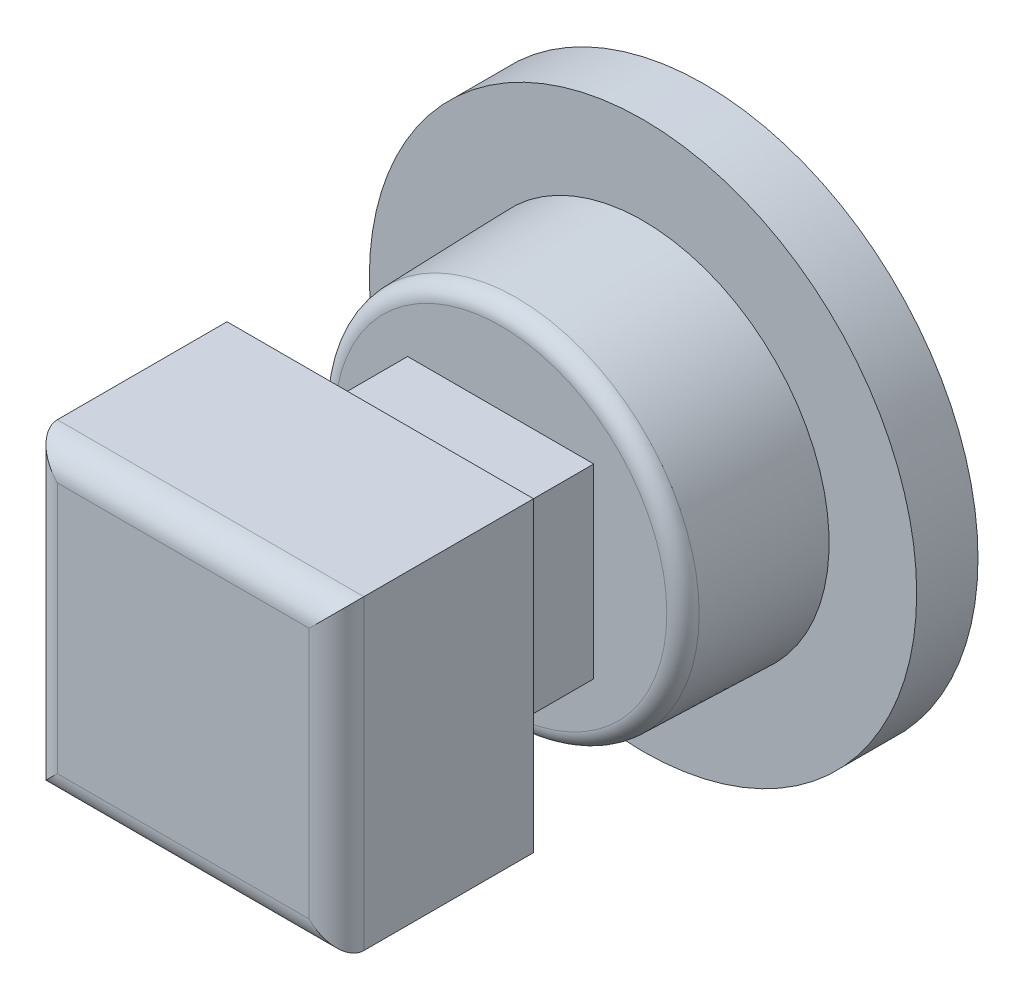
ISO-10303-21;
HEADER;
FILE_DESCRIPTION(('STEP AP214'),'2;1');
FILE_NAME('part.step','',(''),(''),'','','');
FILE_SCHEMA(('AUTOMOTIVE_DESIGN { 1 0 10303 214 1 1 1 1 }'));
ENDSEC;
DATA;
#1=APPLICATION_CONTEXT('core data for automotive mechanical design processes');
#2=APPLICATION_PROTOCOL_DEFINITION('international standard','automotive_design',2000,#1);
#3=PRODUCT_CONTEXT('',#1,'mechanical');
#4=PRODUCT('Part','Part','',(#3));
#5=PRODUCT_RELATED_PRODUCT_CATEGORY('part','',(#4));
#6=PRODUCT_DEFINITION_FORMATION('','',#4);
#7=PRODUCT_DEFINITION_CONTEXT('part definition',#1,'design');
#8=PRODUCT_DEFINITION('design','',#6,#7);
#9=PRODUCT_DEFINITION_SHAPE('','',#8);
#10=(LENGTH_UNIT() NAMED_UNIT(*) SI_UNIT(.MILLI.,.METRE.));
#11=(NAMED_UNIT(*) PLANE_ANGLE_UNIT() SI_UNIT($,.RADIAN.));
#12=(NAMED_UNIT(*) SI_UNIT($,.STERADIAN.) SOLID_ANGLE_UNIT());
#13=UNCERTAINTY_MEASURE_WITH_UNIT(LENGTH_MEASURE(1.E-05),#10,'distance_accuracy_value','');
#14=(GEOMETRIC_REPRESENTATION_CONTEXT(3) GLOBAL_UNCERTAINTY_ASSIGNED_CONTEXT((#13)) GLOBAL_UNIT_ASSIGNED_CONTEXT((#10,
#11,#12)) REPRESENTATION_CONTEXT('',''));
#15=CARTESIAN_POINT('',(0.,0.,0.));
#16=DIRECTION('',(0.,0.,1.));
#17=DIRECTION('',(1.,0.,0.));
#18=AXIS2_PLACEMENT_3D('',#15,#16,#17);
#19=CARTESIAN_POINT('',(0.,0.,4.76));
#20=DIRECTION('',(0.,0.,1.));
#21=DIRECTION('',(1.,0.,0.));
#22=AXIS2_PLACEMENT_3D('',#19,#20,#21);
#23=PLANE('',#22);
#24=DIRECTION('',(1.,0.,0.));
#25=VECTOR('',#24,1.);
#26=CARTESIAN_POINT('',(-0.7,1.15,4.76));
#27=LINE('',#26,#25);
#28=CARTESIAN_POINT('',(-1.15,1.15,4.76));
#29=VERTEX_POINT('',#28);
#30=CARTESIAN_POINT('',(1.15,1.15,4.76));
#31=VERTEX_POINT('',#30);
#32=EDGE_CURVE('E157',#29,#31,#27,.T.);
#33=ORIENTED_EDGE('',*,*,#32,.F.);
#34=DIRECTION('',(0.,1.,0.));
#35=VECTOR('',#34,1.);
#36=CARTESIAN_POINT('',(-1.15,-0.7,4.76));
#37=LINE('',#36,#35);
#38=CARTESIAN_POINT('',(-1.15,-1.15,4.76));
#39=VERTEX_POINT('',#38);
#40=EDGE_CURVE('E171',#39,#29,#37,.T.);
#41=ORIENTED_EDGE('',*,*,#40,.F.);
#42=DIRECTION('',(-1.,0.,0.));
#43=VECTOR('',#42,1.);
#44=CARTESIAN_POINT('',(0.700000000000001,-1.15,4.76));
#45=LINE('',#44,#43);
#46=CARTESIAN_POINT('',(1.15,-1.15,4.76));
#47=VERTEX_POINT('',#46);
#48=EDGE_CURVE('E160',#47,#39,#45,.T.);
#49=ORIENTED_EDGE('',*,*,#48,.F.);
#50=DIRECTION('',(0.,-1.,0.));
#51=VECTOR('',#50,1.);
#52=CARTESIAN_POINT('',(1.15,0.7,4.76));
#53=LINE('',#52,#51);
#54=EDGE_CURVE('E154',#31,#47,#53,.T.);
#55=ORIENTED_EDGE('',*,*,#54,.F.);
#56=EDGE_LOOP('',(#33,#41,#49,#55));
#57=FACE_BOUND('',#56,.T.);
#58=ADVANCED_FACE('F16',(#57),#23,.T.);
#59=CARTESIAN_POINT('',(1.15,0.7,4.51));
#60=DIRECTION('',(0.,-1.,0.));
#61=DIRECTION('',(0.,0.,-1.));
#62=AXIS2_PLACEMENT_3D('',#59,#60,#61);
#63=CYLINDRICAL_SURFACE('',#62,0.25);
#64=DIRECTION('',(0.,1.,0.));
#65=VECTOR('',#64,1.);
#66=CARTESIAN_POINT('',(1.4,1.4,4.51));
#67=LINE('',#66,#65);
#68=CARTESIAN_POINT('',(1.4,1.4,4.51));
#69=VERTEX_POINT('',#68);
#70=CARTESIAN_POINT('',(1.4,-1.4,4.51));
#71=VERTEX_POINT('',#70);
#72=EDGE_CURVE('E168',#69,#71,#67,.F.);
#73=ORIENTED_EDGE('',*,*,#72,.F.);
#74=CARTESIAN_POINT('',(1.15,1.15,4.51));
#75=DIRECTION('',(0.707106781186548,-0.707106781186547,0.));
#76=DIRECTION('',(0.707106781186547,0.707106781186547,0.));
#77=AXIS2_PLACEMENT_3D('',#74,#75,#76);
#78=ELLIPSE('',#77,0.353553390593274,0.25);
#79=EDGE_CURVE('E20',#31,#69,#78,.F.);
#80=ORIENTED_EDGE('',*,*,#79,.F.);
#81=ORIENTED_EDGE('',*,*,#54,.T.);
#82=CARTESIAN_POINT('',(1.15,-1.15,4.51));
#83=DIRECTION('',(-0.707106781186547,-0.707106781186547,0.));
#84=DIRECTION('',(-0.707106781186547,0.707106781186547,0.));
#85=AXIS2_PLACEMENT_3D('',#82,#83,#84);
#86=ELLIPSE('',#85,0.353553390593274,0.25);
#87=EDGE_CURVE('E267',#71,#47,#86,.T.);
#88=ORIENTED_EDGE('',*,*,#87,.F.);
#89=EDGE_LOOP('',(#73,#80,#81,#88));
#90=FACE_BOUND('',#89,.T.);
#91=ADVANCED_FACE('F166',(#90),#63,.T.);
#92=CARTESIAN_POINT('',(-0.7,1.15,4.51));
#93=DIRECTION('',(1.,0.,0.));
#94=DIRECTION('',(0.,1.,0.));
#95=AXIS2_PLACEMENT_3D('',#92,#93,#94);
#96=CYLINDRICAL_SURFACE('',#95,0.25);
#97=DIRECTION('',(1.,0.,0.));
#98=VECTOR('',#97,1.);
#99=CARTESIAN_POINT('',(-1.4,1.4,4.51));
#100=LINE('',#99,#98);
#101=CARTESIAN_POINT('',(-1.4,1.4,4.51));
#102=VERTEX_POINT('',#101);
#103=EDGE_CURVE('E179',#102,#69,#100,.T.);
#104=ORIENTED_EDGE('',*,*,#103,.F.);
#105=CARTESIAN_POINT('',(-1.15,1.15,4.51));
#106=DIRECTION('',(0.707106781186547,0.707106781186548,0.));
#107=DIRECTION('',(-0.707106781186548,0.707106781186547,0.));
#108=AXIS2_PLACEMENT_3D('',#105,#106,#107);
#109=ELLIPSE('',#108,0.353553390593274,0.25);
#110=EDGE_CURVE('E174',#29,#102,#109,.F.);
#111=ORIENTED_EDGE('',*,*,#110,.F.);
#112=ORIENTED_EDGE('',*,*,#32,.T.);
#113=ORIENTED_EDGE('',*,*,#79,.T.);
#114=EDGE_LOOP('',(#104,#111,#112,#113));
#115=FACE_BOUND('',#114,.T.);
#116=ADVANCED_FACE('F172',(#115),#96,.T.);
#117=CARTESIAN_POINT('',(-1.15,-0.7,4.51));
#118=DIRECTION('',(0.,1.,0.));
#119=DIRECTION('',(-1.,0.,0.));
#120=AXIS2_PLACEMENT_3D('',#117,#118,#119);
#121=CYLINDRICAL_SURFACE('',#120,0.25);
#122=DIRECTION('',(0.,1.,0.));
#123=VECTOR('',#122,1.);
#124=CARTESIAN_POINT('',(-1.4,-1.4,4.51));
#125=LINE('',#124,#123);
#126=CARTESIAN_POINT('',(-1.4,-1.4,4.51));
#127=VERTEX_POINT('',#126);
#128=EDGE_CURVE('E183',#127,#102,#125,.T.);
#129=ORIENTED_EDGE('',*,*,#128,.F.);
#130=CARTESIAN_POINT('',(-1.15,-1.15,4.51));
#131=DIRECTION('',(-0.707106781186548,0.707106781186547,0.));
#132=DIRECTION('',(-0.707106781186547,-0.707106781186548,0.));
#133=AXIS2_PLACEMENT_3D('',#130,#131,#132);
#134=ELLIPSE('',#133,0.353553390593274,0.25);
#135=EDGE_CURVE('E269',#39,#127,#134,.F.);
#136=ORIENTED_EDGE('',*,*,#135,.F.);
#137=ORIENTED_EDGE('',*,*,#40,.T.);
#138=ORIENTED_EDGE('',*,*,#110,.T.);
#139=EDGE_LOOP('',(#129,#136,#137,#138));
#140=FACE_BOUND('',#139,.T.);
#141=ADVANCED_FACE('F292',(#140),#121,.T.);
#142=CARTESIAN_POINT('',(0.700000000000001,-1.15,4.51));
#143=DIRECTION('',(-1.,0.,0.));
#144=DIRECTION('',(0.,0.,1.));
#145=AXIS2_PLACEMENT_3D('',#142,#143,#144);
#146=CYLINDRICAL_SURFACE('',#145,0.25);
#147=DIRECTION('',(1.,0.,0.));
#148=VECTOR('',#147,1.);
#149=CARTESIAN_POINT('',(1.4,-1.4,4.51));
#150=LINE('',#149,#148);
#151=EDGE_CURVE('E280',#71,#127,#150,.F.);
#152=ORIENTED_EDGE('',*,*,#151,.F.);
#153=ORIENTED_EDGE('',*,*,#87,.T.);
#154=ORIENTED_EDGE('',*,*,#48,.T.);
#155=ORIENTED_EDGE('',*,*,#135,.T.);
#156=EDGE_LOOP('',(#152,#153,#154,#155));
#157=FACE_BOUND('',#156,.T.);
#158=ADVANCED_FACE('F295',(#157),#146,.T.);
#159=CARTESIAN_POINT('',(1.4,1.4,2.96));
#160=DIRECTION('',(1.,0.,0.));
#161=DIRECTION('',(0.,0.,-1.));
#162=AXIS2_PLACEMENT_3D('',#159,#160,#161);
#163=PLANE('',#162);
#164=DIRECTION('',(0.,1.,0.));
#165=VECTOR('',#164,1.);
#166=CARTESIAN_POINT('',(1.4,0.,2.96));
#167=LINE('',#166,#165);
#168=CARTESIAN_POINT('',(1.4,-1.4,2.96));
#169=VERTEX_POINT('',#168);
#170=CARTESIAN_POINT('',(1.4,1.4,2.96));
#171=VERTEX_POINT('',#170);
#172=EDGE_CURVE('E310',#169,#171,#167,.T.);
#173=ORIENTED_EDGE('',*,*,#172,.T.);
#174=DIRECTION('',(0.,0.,1.));
#175=VECTOR('',#174,1.);
#176=CARTESIAN_POINT('',(1.4,1.4,2.96));
#177=LINE('',#176,#175);
#178=EDGE_CURVE('E181',#69,#171,#177,.F.);
#179=ORIENTED_EDGE('',*,*,#178,.F.);
#180=ORIENTED_EDGE('',*,*,#72,.T.);
#181=DIRECTION('',(0.,0.,-1.));
#182=VECTOR('',#181,1.);
#183=CARTESIAN_POINT('',(1.4,-1.4,2.96));
#184=LINE('',#183,#182);
#185=EDGE_CURVE('E302',#169,#71,#184,.F.);
#186=ORIENTED_EDGE('',*,*,#185,.F.);
#187=EDGE_LOOP('',(#173,#179,#180,#186));
#188=FACE_BOUND('',#187,.T.);
#189=ADVANCED_FACE('F301',(#188),#163,.T.);
#190=CARTESIAN_POINT('',(-1.4,1.4,2.96));
#191=DIRECTION('',(0.,1.,0.));
#192=DIRECTION('',(0.,0.,1.));
#193=AXIS2_PLACEMENT_3D('',#190,#191,#192);
#194=PLANE('',#193);
#195=DIRECTION('',(1.,0.,0.));
#196=VECTOR('',#195,1.);
#197=CARTESIAN_POINT('',(0.,1.4,2.96));
#198=LINE('',#197,#196);
#199=CARTESIAN_POINT('',(-1.4,1.4,2.96));
#200=VERTEX_POINT('',#199);
#201=EDGE_CURVE('E312',#171,#200,#198,.F.);
#202=ORIENTED_EDGE('',*,*,#201,.T.);
#203=DIRECTION('',(0.,0.,1.));
#204=VECTOR('',#203,1.);
#205=CARTESIAN_POINT('',(-1.4,1.4,2.96));
#206=LINE('',#205,#204);
#207=EDGE_CURVE('E278',#102,#200,#206,.F.);
#208=ORIENTED_EDGE('',*,*,#207,.F.);
#209=ORIENTED_EDGE('',*,*,#103,.T.);
#210=ORIENTED_EDGE('',*,*,#178,.T.);
#211=EDGE_LOOP('',(#202,#208,#209,#210));
#212=FACE_BOUND('',#211,.T.);
#213=ADVANCED_FACE('F441',(#212),#194,.T.);
#214=CARTESIAN_POINT('',(-1.4,-1.4,2.96));
#215=DIRECTION('',(-1.,0.,0.));
#216=DIRECTION('',(0.,0.,1.));
#217=AXIS2_PLACEMENT_3D('',#214,#215,#216);
#218=PLANE('',#217);
#219=DIRECTION('',(0.,1.,0.));
#220=VECTOR('',#219,1.);
#221=CARTESIAN_POINT('',(-1.4,0.,2.96));
#222=LINE('',#221,#220);
#223=CARTESIAN_POINT('',(-1.4,-1.4,2.96));
#224=VERTEX_POINT('',#223);
#225=EDGE_CURVE('E317',#200,#224,#222,.F.);
#226=ORIENTED_EDGE('',*,*,#225,.T.);
#227=DIRECTION('',(0.,0.,-1.));
#228=VECTOR('',#227,1.);
#229=CARTESIAN_POINT('',(-1.4,-1.4,2.96));
#230=LINE('',#229,#228);
#231=EDGE_CURVE('E287',#127,#224,#230,.T.);
#232=ORIENTED_EDGE('',*,*,#231,.F.);
#233=ORIENTED_EDGE('',*,*,#128,.T.);
#234=ORIENTED_EDGE('',*,*,#207,.T.);
#235=EDGE_LOOP('',(#226,#232,#233,#234));
#236=FACE_BOUND('',#235,.T.);
#237=ADVANCED_FACE('F290',(#236),#218,.T.);
#238=CARTESIAN_POINT('',(1.4,-1.4,2.96));
#239=DIRECTION('',(0.,-1.,0.));
#240=DIRECTION('',(0.,0.,-1.));
#241=AXIS2_PLACEMENT_3D('',#238,#239,#240);
#242=PLANE('',#241);
#243=DIRECTION('',(1.,0.,0.));
#244=VECTOR('',#243,1.);
#245=CARTESIAN_POINT('',(0.,-1.4,2.96));
#246=LINE('',#245,#244);
#247=EDGE_CURVE('E308',#224,#169,#246,.T.);
#248=ORIENTED_EDGE('',*,*,#247,.T.);
#249=ORIENTED_EDGE('',*,*,#185,.T.);
#250=ORIENTED_EDGE('',*,*,#151,.T.);
#251=ORIENTED_EDGE('',*,*,#231,.T.);
#252=EDGE_LOOP('',(#248,#249,#250,#251));
#253=FACE_BOUND('',#252,.T.);
#254=ADVANCED_FACE('F306',(#253),#242,.T.);
#255=CARTESIAN_POINT('',(0.,0.,2.96));
#256=DIRECTION('',(0.,0.,1.));
#257=DIRECTION('',(1.,0.,0.));
#258=AXIS2_PLACEMENT_3D('',#255,#256,#257);
#259=PLANE('',#258);
#260=DIRECTION('',(1.,0.,0.));
#261=VECTOR('',#260,1.);
#262=CARTESIAN_POINT('',(0.85,-0.85,2.96));
#263=LINE('',#262,#261);
#264=CARTESIAN_POINT('',(0.85,-0.85,2.96));
#265=VERTEX_POINT('',#264);
#266=CARTESIAN_POINT('',(-0.85,-0.85,2.96));
#267=VERTEX_POINT('',#266);
#268=EDGE_CURVE('E320',#265,#267,#263,.F.);
#269=ORIENTED_EDGE('',*,*,#268,.F.);
#270=DIRECTION('',(0.,1.,0.));
#271=VECTOR('',#270,1.);
#272=CARTESIAN_POINT('',(0.85,0.85,2.96));
#273=LINE('',#272,#271);
#274=CARTESIAN_POINT('',(0.85,0.85,2.96));
#275=VERTEX_POINT('',#274);
#276=EDGE_CURVE('E323',#275,#265,#273,.F.);
#277=ORIENTED_EDGE('',*,*,#276,.F.);
#278=DIRECTION('',(1.,0.,0.));
#279=VECTOR('',#278,1.);
#280=CARTESIAN_POINT('',(-0.85,0.85,2.96));
#281=LINE('',#280,#279);
#282=CARTESIAN_POINT('',(-0.85,0.85,2.96));
#283=VERTEX_POINT('',#282);
#284=EDGE_CURVE('E329',#283,#275,#281,.T.);
#285=ORIENTED_EDGE('',*,*,#284,.F.);
#286=DIRECTION('',(0.,1.,0.));
#287=VECTOR('',#286,1.);
#288=CARTESIAN_POINT('',(-0.85,-0.85,2.96));
#289=LINE('',#288,#287);
#290=EDGE_CURVE('E335',#267,#283,#289,.T.);
#291=ORIENTED_EDGE('',*,*,#290,.F.);
#292=EDGE_LOOP('',(#269,#277,#285,#291));
#293=FACE_BOUND('',#292,.T.);
#294=ORIENTED_EDGE('',*,*,#225,.F.);
#295=ORIENTED_EDGE('',*,*,#201,.F.);
#296=ORIENTED_EDGE('',*,*,#172,.F.);
#297=ORIENTED_EDGE('',*,*,#247,.F.);
#298=EDGE_LOOP('',(#294,#295,#296,#297));
#299=FACE_BOUND('',#298,.T.);
#300=ADVANCED_FACE('F427',(#293,#299),#259,.F.);
#301=CARTESIAN_POINT('',(0.85,-0.85,1.86));
#302=DIRECTION('',(0.,-1.,0.));
#303=DIRECTION('',(0.,0.,-1.));
#304=AXIS2_PLACEMENT_3D('',#301,#302,#303);
#305=PLANE('',#304);
#306=DIRECTION('',(-1.,0.,0.));
#307=VECTOR('',#306,1.);
#308=CARTESIAN_POINT('',(0.,-0.85,1.86));
#309=LINE('',#308,#307);
#310=CARTESIAN_POINT('',(-0.85,-0.85,1.86));
#311=VERTEX_POINT('',#310);
#312=CARTESIAN_POINT('',(0.85,-0.85,1.86));
#313=VERTEX_POINT('',#312);
#314=EDGE_CURVE('E344',#311,#313,#309,.F.);
#315=ORIENTED_EDGE('',*,*,#314,.T.);
#316=DIRECTION('',(0.,0.,-1.));
#317=VECTOR('',#316,1.);
#318=CARTESIAN_POINT('',(0.85,-0.85,1.86));
#319=LINE('',#318,#317);
#320=EDGE_CURVE('E326',#265,#313,#319,.T.);
#321=ORIENTED_EDGE('',*,*,#320,.F.);
#322=ORIENTED_EDGE('',*,*,#268,.T.);
#323=DIRECTION('',(0.,0.,1.));
#324=VECTOR('',#323,1.);
#325=CARTESIAN_POINT('',(-0.85,-0.85,1.86));
#326=LINE('',#325,#324);
#327=EDGE_CURVE('E341',#311,#267,#326,.T.);
#328=ORIENTED_EDGE('',*,*,#327,.F.);
#329=EDGE_LOOP('',(#315,#321,#322,#328));
#330=FACE_BOUND('',#329,.T.);
#331=ADVANCED_FACE('F399',(#330),#305,.T.);
#332=CARTESIAN_POINT('',(0.85,0.85,1.86));
#333=DIRECTION('',(1.,0.,0.));
#334=DIRECTION('',(0.,0.,-1.));
#335=AXIS2_PLACEMENT_3D('',#332,#333,#334);
#336=PLANE('',#335);
#337=DIRECTION('',(0.,1.,0.));
#338=VECTOR('',#337,1.);
#339=CARTESIAN_POINT('',(0.85,0.,1.86));
#340=LINE('',#339,#338);
#341=CARTESIAN_POINT('',(0.85,0.85,1.86));
#342=VERTEX_POINT('',#341);
#343=EDGE_CURVE('E391',#313,#342,#340,.T.);
#344=ORIENTED_EDGE('',*,*,#343,.T.);
#345=DIRECTION('',(0.,0.,1.));
#346=VECTOR('',#345,1.);
#347=CARTESIAN_POINT('',(0.85,0.85,1.86));
#348=LINE('',#347,#346);
#349=EDGE_CURVE('E332',#275,#342,#348,.F.);
#350=ORIENTED_EDGE('',*,*,#349,.F.);
#351=ORIENTED_EDGE('',*,*,#276,.T.);
#352=ORIENTED_EDGE('',*,*,#320,.T.);
#353=EDGE_LOOP('',(#344,#350,#351,#352));
#354=FACE_BOUND('',#353,.T.);
#355=ADVANCED_FACE('F408',(#354),#336,.T.);
#356=CARTESIAN_POINT('',(-0.85,0.85,1.86));
#357=DIRECTION('',(0.,1.,0.));
#358=DIRECTION('',(0.,0.,1.));
#359=AXIS2_PLACEMENT_3D('',#356,#357,#358);
#360=PLANE('',#359);
#361=DIRECTION('',(-1.,0.,0.));
#362=VECTOR('',#361,1.);
#363=CARTESIAN_POINT('',(0.,0.85,1.86));
#364=LINE('',#363,#362);
#365=CARTESIAN_POINT('',(-0.85,0.85,1.86));
#366=VERTEX_POINT('',#365);
#367=EDGE_CURVE('E388',#342,#366,#364,.T.);
#368=ORIENTED_EDGE('',*,*,#367,.T.);
#369=DIRECTION('',(0.,0.,1.));
#370=VECTOR('',#369,1.);
#371=CARTESIAN_POINT('',(-0.85,0.85,1.86));
#372=LINE('',#371,#370);
#373=EDGE_CURVE('E338',#283,#366,#372,.F.);
#374=ORIENTED_EDGE('',*,*,#373,.F.);
#375=ORIENTED_EDGE('',*,*,#284,.T.);
#376=ORIENTED_EDGE('',*,*,#349,.T.);
#377=EDGE_LOOP('',(#368,#374,#375,#376));
#378=FACE_BOUND('',#377,.T.);
#379=ADVANCED_FACE('F416',(#378),#360,.T.);
#380=CARTESIAN_POINT('',(-0.85,-0.85,1.86));
#381=DIRECTION('',(-1.,0.,0.));
#382=DIRECTION('',(0.,0.,1.));
#383=AXIS2_PLACEMENT_3D('',#380,#381,#382);
#384=PLANE('',#383);
#385=DIRECTION('',(0.,1.,0.));
#386=VECTOR('',#385,1.);
#387=CARTESIAN_POINT('',(-0.85,0.,1.86));
#388=LINE('',#387,#386);
#389=EDGE_CURVE('E380',#366,#311,#388,.F.);
#390=ORIENTED_EDGE('',*,*,#389,.T.);
#391=ORIENTED_EDGE('',*,*,#327,.T.);
#392=ORIENTED_EDGE('',*,*,#290,.T.);
#393=ORIENTED_EDGE('',*,*,#373,.T.);
#394=EDGE_LOOP('',(#390,#391,#392,#393));
#395=FACE_BOUND('',#394,.T.);
#396=ADVANCED_FACE('F420',(#395),#384,.T.);
#397=CARTESIAN_POINT('',(0.,0.,1.86));
#398=DIRECTION('',(0.,0.,-1.));
#399=DIRECTION('',(-1.,0.,0.));
#400=AXIS2_PLACEMENT_3D('',#397,#398,#399);
#401=PLANE('',#400);
#402=ORIENTED_EDGE('',*,*,#367,.F.);
#403=ORIENTED_EDGE('',*,*,#343,.F.);
#404=ORIENTED_EDGE('',*,*,#314,.F.);
#405=ORIENTED_EDGE('',*,*,#389,.F.);
#406=EDGE_LOOP('',(#402,#403,#404,#405));
#407=FACE_BOUND('',#406,.T.);
#408=CARTESIAN_POINT('',(0.,0.,1.86));
#409=DIRECTION('',(0.,0.,-1.));
#410=DIRECTION('',(1.,0.,0.));
#411=AXIS2_PLACEMENT_3D('',#408,#409,#410);
#412=CIRCLE('',#411,1.51721425333101);
#413=CARTESIAN_POINT('',(1.51721425333101,0.,1.86));
#414=VERTEX_POINT('',#413);
#415=EDGE_CURVE('E376',#414,#414,#412,.T.);
#416=ORIENTED_EDGE('',*,*,#415,.F.);
#417=EDGE_LOOP('',(#416));
#418=FACE_BOUND('',#417,.T.);
#419=ADVANCED_FACE('F363',(#407,#418),#401,.F.);
#420=CARTESIAN_POINT('',(0.,0.,1.71));
#421=DIRECTION('',(0.,0.,-1.));
#422=DIRECTION('',(-1.,0.,0.));
#423=AXIS2_PLACEMENT_3D('',#420,#421,#422);
#424=TOROIDAL_SURFACE('',#423,1.51721425333101,0.15);
#425=CARTESIAN_POINT('',(0.,0.,1.71426675444764));
#426=DIRECTION('',(0.,0.,-1.));
#427=DIRECTION('',(-1.,0.,0.));
#428=AXIS2_PLACEMENT_3D('',#425,#426,#427);
#429=CIRCLE('',#428,1.66715355710956);
#430=CARTESIAN_POINT('',(-1.66715355710956,0.,1.71426675444764));
#431=VERTEX_POINT('',#430);
#432=EDGE_CURVE('E266',#431,#431,#429,.T.);
#433=ORIENTED_EDGE('',*,*,#432,.F.);
#434=EDGE_LOOP('',(#433));
#435=FACE_BOUND('',#434,.T.);
#436=ORIENTED_EDGE('',*,*,#415,.T.);
#437=EDGE_LOOP('',(#436));
#438=FACE_BOUND('',#437,.T.);
#439=ADVANCED_FACE('F351',(#435,#438),#424,.T.);
#440=CARTESIAN_POINT('',(0.,0.,0.560000000007221));
#441=DIRECTION('',(0.,0.,-1.));
#442=DIRECTION('',(-1.,0.,0.));
#443=AXIS2_PLACEMENT_3D('',#440,#441,#442);
#444=CONICAL_SURFACE('',#443,1.69999999999959,0.0284488667753954);
#445=ORIENTED_EDGE('',*,*,#432,.T.);
#446=EDGE_LOOP('',(#445));
#447=FACE_BOUND('',#446,.T.);
#448=CARTESIAN_POINT('',(0.,0.,0.560000000007221));
#449=DIRECTION('',(0.,0.,-1.));
#450=DIRECTION('',(-1.,0.,0.));
#451=AXIS2_PLACEMENT_3D('',#448,#449,#450);
#452=CIRCLE('',#451,1.69999999999959);
#453=CARTESIAN_POINT('',(-1.69999999999959,0.,0.560000000007221));
#454=VERTEX_POINT('',#453);
#455=EDGE_CURVE('E262',#454,#454,#452,.F.);
#456=ORIENTED_EDGE('',*,*,#455,.T.);
#457=EDGE_LOOP('',(#456));
#458=FACE_BOUND('',#457,.T.);
#459=ADVANCED_FACE('F362',(#447,#458),#444,.T.);
#460=CARTESIAN_POINT('',(0.,0.,0.56));
#461=DIRECTION('',(0.,0.,-1.));
#462=DIRECTION('',(-1.,0.,0.));
#463=AXIS2_PLACEMENT_3D('',#460,#461,#462);
#464=PLANE('',#463);
#465=ORIENTED_EDGE('',*,*,#455,.F.);
#466=EDGE_LOOP('',(#465));
#467=FACE_BOUND('',#466,.T.);
#468=CARTESIAN_POINT('',(0.,0.,0.56));
#469=DIRECTION('',(0.,0.,1.));
#470=DIRECTION('',(1.,0.,0.));
#471=AXIS2_PLACEMENT_3D('',#468,#469,#470);
#472=CIRCLE('',#471,2.5);
#473=CARTESIAN_POINT('',(2.5,0.,0.56));
#474=VERTEX_POINT('',#473);
#475=EDGE_CURVE('E258',#474,#474,#472,.F.);
#476=ORIENTED_EDGE('',*,*,#475,.F.);
#477=EDGE_LOOP('',(#476));
#478=FACE_BOUND('',#477,.T.);
#479=ADVANCED_FACE('F540',(#467,#478),#464,.F.);
#480=CARTESIAN_POINT('',(-0.703216951149067,-0.703216951149067,0.25));
#481=DIRECTION('',(0.,0.,1.));
#482=DIRECTION('',(1.,0.,0.));
#483=AXIS2_PLACEMENT_3D('',#480,#481,#482);
#484=PLANE('',#483);
#485=DIRECTION('',(1.,0.,0.));
#486=VECTOR('',#485,1.);
#487=CARTESIAN_POINT('',(-0.703216951149067,-0.15,0.25));
#488=LINE('',#487,#486);
#489=CARTESIAN_POINT('',(-0.862046982478333,-0.15,0.25));
#490=VERTEX_POINT('',#489);
#491=CARTESIAN_POINT('',(-1.27621510726053,-0.15,0.25));
#492=VERTEX_POINT('',#491);
#493=EDGE_CURVE('E265',#490,#492,#488,.F.);
#494=ORIENTED_EDGE('',*,*,#493,.F.);
#495=CARTESIAN_POINT('',(0.,0.,0.25));
#496=DIRECTION('',(0.,0.,1.));
#497=DIRECTION('',(1.,0.,0.));
#498=AXIS2_PLACEMENT_3D('',#495,#496,#497);
#499=CIRCLE('',#498,0.875);
#500=CARTESIAN_POINT('',(-0.15,-0.862046982478333,0.25));
#501=VERTEX_POINT('',#500);
#502=EDGE_CURVE('E249',#501,#490,#499,.F.);
#503=ORIENTED_EDGE('',*,*,#502,.F.);
#504=DIRECTION('',(0.,1.,0.));
#505=VECTOR('',#504,1.);
#506=CARTESIAN_POINT('',(-0.15,-0.862046982478333,0.25));
#507=LINE('',#506,#505);
#508=CARTESIAN_POINT('',(-0.15,-1.27621510726053,0.25));
#509=VERTEX_POINT('',#508);
#510=EDGE_CURVE('E253',#501,#509,#507,.F.);
#511=ORIENTED_EDGE('',*,*,#510,.T.);
#512=CARTESIAN_POINT('',(0.,0.,0.25));
#513=DIRECTION('',(0.,0.,1.));
#514=DIRECTION('',(1.,0.,0.));
#515=AXIS2_PLACEMENT_3D('',#512,#513,#514);
#516=CIRCLE('',#515,1.285);
#517=EDGE_CURVE('E254',#509,#492,#516,.F.);
#518=ORIENTED_EDGE('',*,*,#517,.T.);
#519=EDGE_LOOP('',(#494,#503,#511,#518));
#520=FACE_BOUND('',#519,.T.);
#521=ADVANCED_FACE('F537',(#520),#484,.F.);
#522=CARTESIAN_POINT('',(0.703216951149067,-0.703216951149068,0.25));
#523=DIRECTION('',(0.,0.,1.));
#524=DIRECTION('',(1.,0.,0.));
#525=AXIS2_PLACEMENT_3D('',#522,#523,#524);
#526=PLANE('',#525);
#527=DIRECTION('',(1.,0.,0.));
#528=VECTOR('',#527,1.);
#529=CARTESIAN_POINT('',(0.703216951149067,-0.15,0.25));
#530=LINE('',#529,#528);
#531=CARTESIAN_POINT('',(1.27621510726053,-0.15,0.25));
#532=VERTEX_POINT('',#531);
#533=CARTESIAN_POINT('',(0.862046982478333,-0.15,0.25));
#534=VERTEX_POINT('',#533);
#535=EDGE_CURVE('E559',#532,#534,#530,.F.);
#536=ORIENTED_EDGE('',*,*,#535,.F.);
#537=CARTESIAN_POINT('',(0.,0.,0.25));
#538=DIRECTION('',(0.,0.,1.));
#539=DIRECTION('',(1.,0.,0.));
#540=AXIS2_PLACEMENT_3D('',#537,#538,#539);
#541=CIRCLE('',#540,1.285);
#542=CARTESIAN_POINT('',(0.15,-1.27621510726053,0.25));
#543=VERTEX_POINT('',#542);
#544=EDGE_CURVE('E240',#532,#543,#541,.F.);
#545=ORIENTED_EDGE('',*,*,#544,.T.);
#546=DIRECTION('',(0.,1.,0.));
#547=VECTOR('',#546,1.);
#548=CARTESIAN_POINT('',(0.15,-1.27621510726053,0.25));
#549=LINE('',#548,#547);
#550=CARTESIAN_POINT('',(0.15,-0.862046982478333,0.25));
#551=VERTEX_POINT('',#550);
#552=EDGE_CURVE('E562',#543,#551,#549,.T.);
#553=ORIENTED_EDGE('',*,*,#552,.T.);
#554=CARTESIAN_POINT('',(0.,0.,0.25));
#555=DIRECTION('',(0.,0.,1.));
#556=DIRECTION('',(1.,0.,0.));
#557=AXIS2_PLACEMENT_3D('',#554,#555,#556);
#558=CIRCLE('',#557,0.875);
#559=EDGE_CURVE('E245',#534,#551,#558,.F.);
#560=ORIENTED_EDGE('',*,*,#559,.F.);
#561=EDGE_LOOP('',(#536,#545,#553,#560));
#562=FACE_BOUND('',#561,.T.);
#563=ADVANCED_FACE('F533',(#562),#526,.F.);
#564=CARTESIAN_POINT('',(0.703216951149068,0.703216951149068,0.25));
#565=DIRECTION('',(0.,0.,1.));
#566=DIRECTION('',(1.,0.,0.));
#567=AXIS2_PLACEMENT_3D('',#564,#565,#566);
#568=PLANE('',#567);
#569=DIRECTION('',(1.,0.,0.));
#570=VECTOR('',#569,1.);
#571=CARTESIAN_POINT('',(0.703216951149068,0.15,0.25));
#572=LINE('',#571,#570);
#573=CARTESIAN_POINT('',(0.862046982478333,0.15,0.25));
#574=VERTEX_POINT('',#573);
#575=CARTESIAN_POINT('',(1.27621510726053,0.15,0.25));
#576=VERTEX_POINT('',#575);
#577=EDGE_CURVE('E566',#574,#576,#572,.T.);
#578=ORIENTED_EDGE('',*,*,#577,.F.);
#579=CARTESIAN_POINT('',(0.,0.,0.25));
#580=DIRECTION('',(0.,0.,1.));
#581=DIRECTION('',(1.,0.,0.));
#582=AXIS2_PLACEMENT_3D('',#579,#580,#581);
#583=CIRCLE('',#582,0.875);
#584=CARTESIAN_POINT('',(0.15,0.862046982478333,0.25));
#585=VERTEX_POINT('',#584);
#586=EDGE_CURVE('E230',#585,#574,#583,.F.);
#587=ORIENTED_EDGE('',*,*,#586,.F.);
#588=DIRECTION('',(0.,1.,0.));
#589=VECTOR('',#588,1.);
#590=CARTESIAN_POINT('',(0.15,0.862046982478333,0.25));
#591=LINE('',#590,#589);
#592=CARTESIAN_POINT('',(0.15,1.27621510726053,0.25));
#593=VERTEX_POINT('',#592);
#594=EDGE_CURVE('E234',#585,#593,#591,.T.);
#595=ORIENTED_EDGE('',*,*,#594,.T.);
#596=CARTESIAN_POINT('',(0.,0.,0.25));
#597=DIRECTION('',(0.,0.,1.));
#598=DIRECTION('',(1.,0.,0.));
#599=AXIS2_PLACEMENT_3D('',#596,#597,#598);
#600=CIRCLE('',#599,1.285);
#601=EDGE_CURVE('E235',#593,#576,#600,.F.);
#602=ORIENTED_EDGE('',*,*,#601,.T.);
#603=EDGE_LOOP('',(#578,#587,#595,#602));
#604=FACE_BOUND('',#603,.T.);
#605=ADVANCED_FACE('F529',(#604),#568,.F.);
#606=CARTESIAN_POINT('',(-0.703216951149067,0.703216951149068,0.25));
#607=DIRECTION('',(0.,0.,1.));
#608=DIRECTION('',(1.,0.,0.));
#609=AXIS2_PLACEMENT_3D('',#606,#607,#608);
#610=PLANE('',#609);
#611=DIRECTION('',(1.,0.,0.));
#612=VECTOR('',#611,1.);
#613=CARTESIAN_POINT('',(-0.703216951149067,0.15,0.25));
#614=LINE('',#613,#612);
#615=CARTESIAN_POINT('',(-1.27621510726053,0.15,0.25));
#616=VERTEX_POINT('',#615);
#617=CARTESIAN_POINT('',(-0.862046982478333,0.15,0.25));
#618=VERTEX_POINT('',#617);
#619=EDGE_CURVE('E261',#616,#618,#614,.T.);
#620=ORIENTED_EDGE('',*,*,#619,.F.);
#621=CARTESIAN_POINT('',(0.,0.,0.25));
#622=DIRECTION('',(0.,0.,1.));
#623=DIRECTION('',(1.,0.,0.));
#624=AXIS2_PLACEMENT_3D('',#621,#622,#623);
#625=CIRCLE('',#624,1.285);
#626=CARTESIAN_POINT('',(-0.15,1.27621510726053,0.25));
#627=VERTEX_POINT('',#626);
#628=EDGE_CURVE('E222',#616,#627,#625,.F.);
#629=ORIENTED_EDGE('',*,*,#628,.T.);
#630=DIRECTION('',(0.,1.,0.));
#631=VECTOR('',#630,1.);
#632=CARTESIAN_POINT('',(-0.15,1.27621510726053,0.25));
#633=LINE('',#632,#631);
#634=CARTESIAN_POINT('',(-0.15,0.862046982478333,0.25));
#635=VERTEX_POINT('',#634);
#636=EDGE_CURVE('E570',#627,#635,#633,.F.);
#637=ORIENTED_EDGE('',*,*,#636,.T.);
#638=CARTESIAN_POINT('',(0.,0.,0.25));
#639=DIRECTION('',(0.,0.,1.));
#640=DIRECTION('',(1.,0.,0.));
#641=AXIS2_PLACEMENT_3D('',#638,#639,#640);
#642=CIRCLE('',#641,0.875);
#643=EDGE_CURVE('E226',#618,#635,#642,.F.);
#644=ORIENTED_EDGE('',*,*,#643,.F.);
#645=EDGE_LOOP('',(#620,#629,#637,#644));
#646=FACE_BOUND('',#645,.T.);
#647=ADVANCED_FACE('F525',(#646),#610,.F.);
#648=CARTESIAN_POINT('',(0.,0.,0.));
#649=DIRECTION('',(0.,0.,1.));
#650=DIRECTION('',(1.,0.,0.));
#651=AXIS2_PLACEMENT_3D('',#648,#649,#650);
#652=CYLINDRICAL_SURFACE('',#651,2.5);
#653=CARTESIAN_POINT('',(0.,0.,0.));
#654=DIRECTION('',(0.,0.,1.));
#655=DIRECTION('',(1.,0.,0.));
#656=AXIS2_PLACEMENT_3D('',#653,#654,#655);
#657=CIRCLE('',#656,2.5);
#658=CARTESIAN_POINT('',(2.5,0.,0.));
#659=VERTEX_POINT('',#658);
#660=EDGE_CURVE('E218',#659,#659,#657,.F.);
#661=ORIENTED_EDGE('',*,*,#660,.F.);
#662=EDGE_LOOP('',(#661));
#663=FACE_BOUND('',#662,.T.);
#664=ORIENTED_EDGE('',*,*,#475,.T.);
#665=EDGE_LOOP('',(#664));
#666=FACE_BOUND('',#665,.T.);
#667=ADVANCED_FACE('F522',(#663,#666),#652,.T.);
#668=CARTESIAN_POINT('',(-0.049286756828323,0.,0.249999999999999));
#669=DIRECTION('',(0.,-1.,0.));
#670=DIRECTION('',(1.,0.,0.));
#671=AXIS2_PLACEMENT_3D('',#668,#669,#670);
#672=CIRCLE('',#671,0.911333739306656);
#673=TRIMMED_CURVE('',#672,(PARAMETER_VALUE(-1.51668792221012)),
(PARAMETER_VALUE(1.51668792221012)),.T.,.PARAMETER.);
#674=CARTESIAN_POINT('',(0.,0.,0.249999999999999));
#675=DIRECTION('',(0.,0.,1.));
#676=AXIS1_PLACEMENT('',#674,#675);
#677=SURFACE_OF_REVOLUTION('',#673,#676);
#678=CARTESIAN_POINT('',(0.,0.,-0.66));
#679=VERTEX_POINT('',#678);
#680=VERTEX_LOOP('',#679);
#681=FACE_BOUND('',#680,.T.);
#682=CARTESIAN_POINT('',(0.,0.,0.));
#683=DIRECTION('',(0.,0.,1.));
#684=DIRECTION('',(1.,0.,0.));
#685=AXIS2_PLACEMENT_3D('',#682,#683,#684);
#686=CIRCLE('',#685,0.827085986014956);
#687=CARTESIAN_POINT('',(0.827085986014956,0.,0.));
#688=VERTEX_POINT('',#687);
#689=EDGE_CURVE('E215',#688,#688,#686,.T.);
#690=ORIENTED_EDGE('',*,*,#689,.F.);
#691=EDGE_LOOP('',(#690));
#692=FACE_BOUND('',#691,.T.);
#693=ADVANCED_FACE('F18',(#681,#692),#677,.T.);
#694=CARTESIAN_POINT('',(0.,0.,0.));
#695=DIRECTION('',(0.,0.,1.));
#696=DIRECTION('',(1.,0.,0.));
#697=AXIS2_PLACEMENT_3D('',#694,#695,#696);
#698=CYLINDRICAL_SURFACE('',#697,1.285);
#699=DIRECTION('',(0.,0.,-1.));
#700=VECTOR('',#699,1.);
#701=CARTESIAN_POINT('',(-0.15,-1.27621510726053,0.));
#702=LINE('',#701,#700);
#703=CARTESIAN_POINT('',(-0.15,-1.27621510726053,0.));
#704=VERTEX_POINT('',#703);
#705=EDGE_CURVE('E257',#509,#704,#702,.T.);
#706=ORIENTED_EDGE('',*,*,#705,.T.);
#707=CARTESIAN_POINT('',(0.,0.,0.));
#708=DIRECTION('',(0.,0.,1.));
#709=DIRECTION('',(1.,0.,0.));
#710=AXIS2_PLACEMENT_3D('',#707,#708,#709);
#711=CIRCLE('',#710,1.285);
#712=CARTESIAN_POINT('',(-1.27621510726053,-0.15,0.));
#713=VERTEX_POINT('',#712);
#714=EDGE_CURVE('E212',#713,#704,#711,.T.);
#715=ORIENTED_EDGE('',*,*,#714,.F.);
#716=DIRECTION('',(0.,0.,1.));
#717=VECTOR('',#716,1.);
#718=CARTESIAN_POINT('',(-1.27621510726053,-0.15,0.));
#719=LINE('',#718,#717);
#720=EDGE_CURVE('E248',#713,#492,#719,.T.);
#721=ORIENTED_EDGE('',*,*,#720,.T.);
#722=ORIENTED_EDGE('',*,*,#517,.F.);
#723=EDGE_LOOP('',(#706,#715,#721,#722));
#724=FACE_BOUND('',#723,.T.);
#725=ADVANCED_FACE('F517',(#724),#698,.F.);
#726=CARTESIAN_POINT('',(-0.15,-0.862046982478333,0.));
#727=DIRECTION('',(1.,0.,0.));
#728=DIRECTION('',(0.,0.,-1.));
#729=AXIS2_PLACEMENT_3D('',#726,#727,#728);
#730=PLANE('',#729);
#731=DIRECTION('',(0.,0.,1.));
#732=VECTOR('',#731,1.);
#733=CARTESIAN_POINT('',(-0.15,-0.862046982478333,0.));
#734=LINE('',#733,#732);
#735=CARTESIAN_POINT('',(-0.15,-0.862046982478333,0.));
#736=VERTEX_POINT('',#735);
#737=EDGE_CURVE('E252',#736,#501,#734,.T.);
#738=ORIENTED_EDGE('',*,*,#737,.F.);
#739=DIRECTION('',(0.,1.,0.));
#740=VECTOR('',#739,1.);
#741=CARTESIAN_POINT('',(-0.15,0.,0.));
#742=LINE('',#741,#740);
#743=EDGE_CURVE('E211',#704,#736,#742,.T.);
#744=ORIENTED_EDGE('',*,*,#743,.F.);
#745=ORIENTED_EDGE('',*,*,#705,.F.);
#746=ORIENTED_EDGE('',*,*,#510,.F.);
#747=EDGE_LOOP('',(#738,#744,#745,#746));
#748=FACE_BOUND('',#747,.T.);
#749=ADVANCED_FACE('F513',(#748),#730,.F.);
#750=CARTESIAN_POINT('',(0.,0.,0.));
#751=DIRECTION('',(0.,0.,1.));
#752=DIRECTION('',(1.,0.,0.));
#753=AXIS2_PLACEMENT_3D('',#750,#751,#752);
#754=CYLINDRICAL_SURFACE('',#753,0.875);
#755=CARTESIAN_POINT('',(0.,0.,0.));
#756=DIRECTION('',(0.,0.,1.));
#757=DIRECTION('',(1.,0.,0.));
#758=AXIS2_PLACEMENT_3D('',#755,#756,#757);
#759=CIRCLE('',#758,0.875);
#760=CARTESIAN_POINT('',(-0.862046982478333,-0.15,0.));
#761=VERTEX_POINT('',#760);
#762=EDGE_CURVE('E208',#736,#761,#759,.F.);
#763=ORIENTED_EDGE('',*,*,#762,.F.);
#764=ORIENTED_EDGE('',*,*,#737,.T.);
#765=ORIENTED_EDGE('',*,*,#502,.T.);
#766=DIRECTION('',(0.,0.,1.));
#767=VECTOR('',#766,1.);
#768=CARTESIAN_POINT('',(-0.862046982478333,-0.15,0.));
#769=LINE('',#768,#767);
#770=EDGE_CURVE('E577',#490,#761,#769,.F.);
#771=ORIENTED_EDGE('',*,*,#770,.T.);
#772=EDGE_LOOP('',(#763,#764,#765,#771));
#773=FACE_BOUND('',#772,.T.);
#774=ADVANCED_FACE('F509',(#773),#754,.T.);
#775=CARTESIAN_POINT('',(-1.27621510726053,-0.15,0.));
#776=DIRECTION('',(0.,1.,0.));
#777=DIRECTION('',(0.,0.,1.));
#778=AXIS2_PLACEMENT_3D('',#775,#776,#777);
#779=PLANE('',#778);
#780=ORIENTED_EDGE('',*,*,#720,.F.);
#781=DIRECTION('',(-1.,0.,0.));
#782=VECTOR('',#781,1.);
#783=CARTESIAN_POINT('',(0.,-0.15,0.));
#784=LINE('',#783,#782);
#785=EDGE_CURVE('E207',#761,#713,#784,.T.);
#786=ORIENTED_EDGE('',*,*,#785,.F.);
#787=ORIENTED_EDGE('',*,*,#770,.F.);
#788=ORIENTED_EDGE('',*,*,#493,.T.);
#789=EDGE_LOOP('',(#780,#786,#787,#788));
#790=FACE_BOUND('',#789,.T.);
#791=ADVANCED_FACE('F505',(#790),#779,.F.);
#792=CARTESIAN_POINT('',(0.,0.,0.));
#793=DIRECTION('',(0.,0.,1.));
#794=DIRECTION('',(1.,0.,0.));
#795=AXIS2_PLACEMENT_3D('',#792,#793,#794);
#796=CYLINDRICAL_SURFACE('',#795,0.875);
#797=CARTESIAN_POINT('',(0.,0.,0.));
#798=DIRECTION('',(0.,0.,1.));
#799=DIRECTION('',(1.,0.,0.));
#800=AXIS2_PLACEMENT_3D('',#797,#798,#799);
#801=CIRCLE('',#800,0.875);
#802=CARTESIAN_POINT('',(0.862046982478333,-0.15,0.));
#803=VERTEX_POINT('',#802);
#804=CARTESIAN_POINT('',(0.15,-0.862046982478333,0.));
#805=VERTEX_POINT('',#804);
#806=EDGE_CURVE('E204',#803,#805,#801,.F.);
#807=ORIENTED_EDGE('',*,*,#806,.F.);
#808=DIRECTION('',(0.,0.,1.));
#809=VECTOR('',#808,1.);
#810=CARTESIAN_POINT('',(0.862046982478333,-0.15,0.));
#811=LINE('',#810,#809);
#812=EDGE_CURVE('E239',#803,#534,#811,.T.);
#813=ORIENTED_EDGE('',*,*,#812,.T.);
#814=ORIENTED_EDGE('',*,*,#559,.T.);
#815=DIRECTION('',(0.,0.,1.));
#816=VECTOR('',#815,1.);
#817=CARTESIAN_POINT('',(0.15,-0.862046982478333,0.));
#818=LINE('',#817,#816);
#819=EDGE_CURVE('E247',#551,#805,#818,.F.);
#820=ORIENTED_EDGE('',*,*,#819,.T.);
#821=EDGE_LOOP('',(#807,#813,#814,#820));
#822=FACE_BOUND('',#821,.T.);
#823=ADVANCED_FACE('F501',(#822),#796,.T.);
#824=CARTESIAN_POINT('',(0.15,-1.27621510726053,0.));
#825=DIRECTION('',(-1.,0.,0.));
#826=DIRECTION('',(0.,0.,1.));
#827=AXIS2_PLACEMENT_3D('',#824,#825,#826);
#828=PLANE('',#827);
#829=DIRECTION('',(0.,0.,1.));
#830=VECTOR('',#829,1.);
#831=CARTESIAN_POINT('',(0.149999999999999,-1.27621510726053,0.));
#832=LINE('',#831,#830);
#833=CARTESIAN_POINT('',(0.15,-1.27621510726053,0.));
#834=VERTEX_POINT('',#833);
#835=EDGE_CURVE('E244',#543,#834,#832,.F.);
#836=ORIENTED_EDGE('',*,*,#835,.T.);
#837=DIRECTION('',(0.,1.,0.));
#838=VECTOR('',#837,1.);
#839=CARTESIAN_POINT('',(0.15,0.,0.));
#840=LINE('',#839,#838);
#841=EDGE_CURVE('E203',#805,#834,#840,.F.);
#842=ORIENTED_EDGE('',*,*,#841,.F.);
#843=ORIENTED_EDGE('',*,*,#819,.F.);
#844=ORIENTED_EDGE('',*,*,#552,.F.);
#845=EDGE_LOOP('',(#836,#842,#843,#844));
#846=FACE_BOUND('',#845,.T.);
#847=ADVANCED_FACE('F497',(#846),#828,.F.);
#848=CARTESIAN_POINT('',(0.,0.,0.));
#849=DIRECTION('',(0.,0.,1.));
#850=DIRECTION('',(1.,0.,0.));
#851=AXIS2_PLACEMENT_3D('',#848,#849,#850);
#852=CYLINDRICAL_SURFACE('',#851,1.285);
#853=DIRECTION('',(0.,0.,1.));
#854=VECTOR('',#853,1.);
#855=CARTESIAN_POINT('',(1.27621510726053,-0.15,0.));
#856=LINE('',#855,#854);
#857=CARTESIAN_POINT('',(1.27621510726053,-0.15,0.));
#858=VERTEX_POINT('',#857);
#859=EDGE_CURVE('E243',#532,#858,#856,.F.);
#860=ORIENTED_EDGE('',*,*,#859,.T.);
#861=CARTESIAN_POINT('',(0.,0.,0.));
#862=DIRECTION('',(0.,0.,1.));
#863=DIRECTION('',(1.,0.,0.));
#864=AXIS2_PLACEMENT_3D('',#861,#862,#863);
#865=CIRCLE('',#864,1.285);
#866=EDGE_CURVE('E200',#834,#858,#865,.T.);
#867=ORIENTED_EDGE('',*,*,#866,.F.);
#868=ORIENTED_EDGE('',*,*,#835,.F.);
#869=ORIENTED_EDGE('',*,*,#544,.F.);
#870=EDGE_LOOP('',(#860,#867,#868,#869));
#871=FACE_BOUND('',#870,.T.);
#872=ADVANCED_FACE('F493',(#871),#852,.F.);
#873=CARTESIAN_POINT('',(0.862046982478333,-0.15,0.));
#874=DIRECTION('',(0.,1.,0.));
#875=DIRECTION('',(0.,0.,1.));
#876=AXIS2_PLACEMENT_3D('',#873,#874,#875);
#877=PLANE('',#876);
#878=ORIENTED_EDGE('',*,*,#812,.F.);
#879=DIRECTION('',(-1.,0.,0.));
#880=VECTOR('',#879,1.);
#881=CARTESIAN_POINT('',(0.,-0.15,0.));
#882=LINE('',#881,#880);
#883=EDGE_CURVE('E199',#858,#803,#882,.T.);
#884=ORIENTED_EDGE('',*,*,#883,.F.);
#885=ORIENTED_EDGE('',*,*,#859,.F.);
#886=ORIENTED_EDGE('',*,*,#535,.T.);
#887=EDGE_LOOP('',(#878,#884,#885,#886));
#888=FACE_BOUND('',#887,.T.);
#889=ADVANCED_FACE('F489',(#888),#877,.F.);
#890=CARTESIAN_POINT('',(0.,0.,0.));
#891=DIRECTION('',(0.,0.,1.));
#892=DIRECTION('',(1.,0.,0.));
#893=AXIS2_PLACEMENT_3D('',#890,#891,#892);
#894=CYLINDRICAL_SURFACE('',#893,1.285);
#895=DIRECTION('',(0.,0.,1.));
#896=VECTOR('',#895,1.);
#897=CARTESIAN_POINT('',(0.15,1.27621510726053,0.));
#898=LINE('',#897,#896);
#899=CARTESIAN_POINT('',(0.15,1.27621510726053,0.));
#900=VERTEX_POINT('',#899);
#901=EDGE_CURVE('E238',#593,#900,#898,.F.);
#902=ORIENTED_EDGE('',*,*,#901,.T.);
#903=CARTESIAN_POINT('',(0.,0.,0.));
#904=DIRECTION('',(0.,0.,1.));
#905=DIRECTION('',(1.,0.,0.));
#906=AXIS2_PLACEMENT_3D('',#903,#904,#905);
#907=CIRCLE('',#906,1.285);
#908=CARTESIAN_POINT('',(1.27621510726053,0.15,0.));
#909=VERTEX_POINT('',#908);
#910=EDGE_CURVE('E196',#909,#900,#907,.T.);
#911=ORIENTED_EDGE('',*,*,#910,.F.);
#912=DIRECTION('',(0.,0.,-1.));
#913=VECTOR('',#912,1.);
#914=CARTESIAN_POINT('',(1.27621510726053,0.15,0.));
#915=LINE('',#914,#913);
#916=EDGE_CURVE('E229',#909,#576,#915,.F.);
#917=ORIENTED_EDGE('',*,*,#916,.T.);
#918=ORIENTED_EDGE('',*,*,#601,.F.);
#919=EDGE_LOOP('',(#902,#911,#917,#918));
#920=FACE_BOUND('',#919,.T.);
#921=ADVANCED_FACE('F485',(#920),#894,.F.);
#922=CARTESIAN_POINT('',(0.15,0.862046982478333,0.));
#923=DIRECTION('',(-1.,0.,0.));
#924=DIRECTION('',(0.,0.,1.));
#925=AXIS2_PLACEMENT_3D('',#922,#923,#924);
#926=PLANE('',#925);
#927=DIRECTION('',(0.,0.,1.));
#928=VECTOR('',#927,1.);
#929=CARTESIAN_POINT('',(0.15,0.862046982478333,0.));
#930=LINE('',#929,#928);
#931=CARTESIAN_POINT('',(0.15,0.862046982478333,0.));
#932=VERTEX_POINT('',#931);
#933=EDGE_CURVE('E233',#932,#585,#930,.T.);
#934=ORIENTED_EDGE('',*,*,#933,.F.);
#935=DIRECTION('',(0.,1.,0.));
#936=VECTOR('',#935,1.);
#937=CARTESIAN_POINT('',(0.15,0.,0.));
#938=LINE('',#937,#936);
#939=EDGE_CURVE('E195',#900,#932,#938,.F.);
#940=ORIENTED_EDGE('',*,*,#939,.F.);
#941=ORIENTED_EDGE('',*,*,#901,.F.);
#942=ORIENTED_EDGE('',*,*,#594,.F.);
#943=EDGE_LOOP('',(#934,#940,#941,#942));
#944=FACE_BOUND('',#943,.T.);
#945=ADVANCED_FACE('F481',(#944),#926,.F.);
#946=CARTESIAN_POINT('',(0.,0.,0.));
#947=DIRECTION('',(0.,0.,1.));
#948=DIRECTION('',(1.,0.,0.));
#949=AXIS2_PLACEMENT_3D('',#946,#947,#948);
#950=CYLINDRICAL_SURFACE('',#949,0.875);
#951=CARTESIAN_POINT('',(0.,0.,0.));
#952=DIRECTION('',(0.,0.,1.));
#953=DIRECTION('',(1.,0.,0.));
#954=AXIS2_PLACEMENT_3D('',#951,#952,#953);
#955=CIRCLE('',#954,0.875);
#956=CARTESIAN_POINT('',(0.862046982478333,0.15,0.));
#957=VERTEX_POINT('',#956);
#958=EDGE_CURVE('E192',#932,#957,#955,.F.);
#959=ORIENTED_EDGE('',*,*,#958,.F.);
#960=ORIENTED_EDGE('',*,*,#933,.T.);
#961=ORIENTED_EDGE('',*,*,#586,.T.);
#962=DIRECTION('',(0.,0.,-1.));
#963=VECTOR('',#962,1.);
#964=CARTESIAN_POINT('',(0.862046982478333,0.15,0.));
#965=LINE('',#964,#963);
#966=EDGE_CURVE('E589',#574,#957,#965,.T.);
#967=ORIENTED_EDGE('',*,*,#966,.T.);
#968=EDGE_LOOP('',(#959,#960,#961,#967));
#969=FACE_BOUND('',#968,.T.);
#970=ADVANCED_FACE('F477',(#969),#950,.T.);
#971=CARTESIAN_POINT('',(1.27621510726053,0.15,0.));
#972=DIRECTION('',(0.,-1.,0.));
#973=DIRECTION('',(0.,0.,-1.));
#974=AXIS2_PLACEMENT_3D('',#971,#972,#973);
#975=PLANE('',#974);
#976=ORIENTED_EDGE('',*,*,#916,.F.);
#977=DIRECTION('',(-1.,0.,0.));
#978=VECTOR('',#977,1.);
#979=CARTESIAN_POINT('',(0.,0.15,0.));
#980=LINE('',#979,#978);
#981=EDGE_CURVE('E191',#957,#909,#980,.F.);
#982=ORIENTED_EDGE('',*,*,#981,.F.);
#983=ORIENTED_EDGE('',*,*,#966,.F.);
#984=ORIENTED_EDGE('',*,*,#577,.T.);
#985=EDGE_LOOP('',(#976,#982,#983,#984));
#986=FACE_BOUND('',#985,.T.);
#987=ADVANCED_FACE('F473',(#986),#975,.F.);
#988=CARTESIAN_POINT('',(0.,0.,0.));
#989=DIRECTION('',(0.,0.,1.));
#990=DIRECTION('',(1.,0.,0.));
#991=AXIS2_PLACEMENT_3D('',#988,#989,#990);
#992=CYLINDRICAL_SURFACE('',#991,0.875);
#993=CARTESIAN_POINT('',(0.,0.,0.));
#994=DIRECTION('',(0.,0.,1.));
#995=DIRECTION('',(1.,0.,0.));
#996=AXIS2_PLACEMENT_3D('',#993,#994,#995);
#997=CIRCLE('',#996,0.875);
#998=CARTESIAN_POINT('',(-0.862046982478333,0.15,0.));
#999=VERTEX_POINT('',#998);
#1000=CARTESIAN_POINT('',(-0.15,0.862046982478333,0.));
#1001=VERTEX_POINT('',#1000);
#1002=EDGE_CURVE('E188',#999,#1001,#997,.F.);
#1003=ORIENTED_EDGE('',*,*,#1002,.F.);
#1004=DIRECTION('',(0.,0.,-1.));
#1005=VECTOR('',#1004,1.);
#1006=CARTESIAN_POINT('',(-0.862046982478333,0.15,0.));
#1007=LINE('',#1006,#1005);
#1008=EDGE_CURVE('E221',#999,#618,#1007,.F.);
#1009=ORIENTED_EDGE('',*,*,#1008,.T.);
#1010=ORIENTED_EDGE('',*,*,#643,.T.);
#1011=DIRECTION('',(0.,0.,-1.));
#1012=VECTOR('',#1011,1.);
#1013=CARTESIAN_POINT('',(-0.15,0.862046982478333,0.));
#1014=LINE('',#1013,#1012);
#1015=EDGE_CURVE('E228',#635,#1001,#1014,.T.);
#1016=ORIENTED_EDGE('',*,*,#1015,.T.);
#1017=EDGE_LOOP('',(#1003,#1009,#1010,#1016));
#1018=FACE_BOUND('',#1017,.T.);
#1019=ADVANCED_FACE('F469',(#1018),#992,.T.);
#1020=CARTESIAN_POINT('',(-0.15,1.27621510726053,0.));
#1021=DIRECTION('',(1.,0.,0.));
#1022=DIRECTION('',(0.,0.,-1.));
#1023=AXIS2_PLACEMENT_3D('',#1020,#1021,#1022);
#1024=PLANE('',#1023);
#1025=DIRECTION('',(0.,0.,1.));
#1026=VECTOR('',#1025,1.);
#1027=CARTESIAN_POINT('',(-0.15,1.27621510726053,0.));
#1028=LINE('',#1027,#1026);
#1029=CARTESIAN_POINT('',(-0.15,1.27621510726053,0.));
#1030=VERTEX_POINT('',#1029);
#1031=EDGE_CURVE('E225',#627,#1030,#1028,.F.);
#1032=ORIENTED_EDGE('',*,*,#1031,.T.);
#1033=DIRECTION('',(0.,1.,0.));
#1034=VECTOR('',#1033,1.);
#1035=CARTESIAN_POINT('',(-0.15,0.,0.));
#1036=LINE('',#1035,#1034);
#1037=EDGE_CURVE('E187',#1001,#1030,#1036,.T.);
#1038=ORIENTED_EDGE('',*,*,#1037,.F.);
#1039=ORIENTED_EDGE('',*,*,#1015,.F.);
#1040=ORIENTED_EDGE('',*,*,#636,.F.);
#1041=EDGE_LOOP('',(#1032,#1038,#1039,#1040));
#1042=FACE_BOUND('',#1041,.T.);
#1043=ADVANCED_FACE('F466',(#1042),#1024,.F.);
#1044=CARTESIAN_POINT('',(0.,0.,0.));
#1045=DIRECTION('',(0.,0.,1.));
#1046=DIRECTION('',(1.,0.,0.));
#1047=AXIS2_PLACEMENT_3D('',#1044,#1045,#1046);
#1048=CYLINDRICAL_SURFACE('',#1047,1.285);
#1049=DIRECTION('',(0.,0.,-1.));
#1050=VECTOR('',#1049,1.);
#1051=CARTESIAN_POINT('',(-1.27621510726053,0.15,0.));
#1052=LINE('',#1051,#1050);
#1053=CARTESIAN_POINT('',(-1.27621510726053,0.15,0.));
#1054=VERTEX_POINT('',#1053);
#1055=EDGE_CURVE('E35',#616,#1054,#1052,.T.);
#1056=ORIENTED_EDGE('',*,*,#1055,.T.);
#1057=CARTESIAN_POINT('',(0.,0.,0.));
#1058=DIRECTION('',(0.,0.,1.));
#1059=DIRECTION('',(1.,0.,0.));
#1060=AXIS2_PLACEMENT_3D('',#1057,#1058,#1059);
#1061=CIRCLE('',#1060,1.285);
#1062=EDGE_CURVE('E26',#1030,#1054,#1061,.T.);
#1063=ORIENTED_EDGE('',*,*,#1062,.F.);
#1064=ORIENTED_EDGE('',*,*,#1031,.F.);
#1065=ORIENTED_EDGE('',*,*,#628,.F.);
#1066=EDGE_LOOP('',(#1056,#1063,#1064,#1065));
#1067=FACE_BOUND('',#1066,.T.);
#1068=ADVANCED_FACE('F459',(#1067),#1048,.F.);
#1069=CARTESIAN_POINT('',(-0.862046982478333,0.15,0.));
#1070=DIRECTION('',(0.,-1.,0.));
#1071=DIRECTION('',(0.,0.,-1.));
#1072=AXIS2_PLACEMENT_3D('',#1069,#1070,#1071);
#1073=PLANE('',#1072);
#1074=ORIENTED_EDGE('',*,*,#1008,.F.);
#1075=DIRECTION('',(-1.,0.,0.));
#1076=VECTOR('',#1075,1.);
#1077=CARTESIAN_POINT('',(0.,0.15,0.));
#1078=LINE('',#1077,#1076);
#1079=EDGE_CURVE('E10',#1054,#999,#1078,.F.);
#1080=ORIENTED_EDGE('',*,*,#1079,.F.);
#1081=ORIENTED_EDGE('',*,*,#1055,.F.);
#1082=ORIENTED_EDGE('',*,*,#619,.T.);
#1083=EDGE_LOOP('',(#1074,#1080,#1081,#1082));
#1084=FACE_BOUND('',#1083,.T.);
#1085=ADVANCED_FACE('F453',(#1084),#1073,.F.);
#1086=CARTESIAN_POINT('',(0.,0.,0.));
#1087=DIRECTION('',(0.,0.,-1.));
#1088=DIRECTION('',(-1.,0.,0.));
#1089=AXIS2_PLACEMENT_3D('',#1086,#1087,#1088);
#1090=PLANE('',#1089);
#1091=ORIENTED_EDGE('',*,*,#1062,.T.);
#1092=ORIENTED_EDGE('',*,*,#1079,.T.);
#1093=ORIENTED_EDGE('',*,*,#1002,.T.);
#1094=ORIENTED_EDGE('',*,*,#1037,.T.);
#1095=EDGE_LOOP('',(#1091,#1092,#1093,#1094));
#1096=FACE_BOUND('',#1095,.T.);
#1097=ORIENTED_EDGE('',*,*,#958,.T.);
#1098=ORIENTED_EDGE('',*,*,#981,.T.);
#1099=ORIENTED_EDGE('',*,*,#910,.T.);
#1100=ORIENTED_EDGE('',*,*,#939,.T.);
#1101=EDGE_LOOP('',(#1097,#1098,#1099,#1100));
#1102=FACE_BOUND('',#1101,.T.);
#1103=ORIENTED_EDGE('',*,*,#866,.T.);
#1104=ORIENTED_EDGE('',*,*,#883,.T.);
#1105=ORIENTED_EDGE('',*,*,#806,.T.);
#1106=ORIENTED_EDGE('',*,*,#841,.T.);
#1107=EDGE_LOOP('',(#1103,#1104,#1105,#1106));
#1108=FACE_BOUND('',#1107,.T.);
#1109=ORIENTED_EDGE('',*,*,#762,.T.);
#1110=ORIENTED_EDGE('',*,*,#785,.T.);
#1111=ORIENTED_EDGE('',*,*,#714,.T.);
#1112=ORIENTED_EDGE('',*,*,#743,.T.);
#1113=EDGE_LOOP('',(#1109,#1110,#1111,#1112));
#1114=FACE_BOUND('',#1113,.T.);
#1115=ORIENTED_EDGE('',*,*,#689,.T.);
#1116=EDGE_LOOP('',(#1115));
#1117=FACE_BOUND('',#1116,.T.);
#1118=ORIENTED_EDGE('',*,*,#660,.T.);
#1119=EDGE_LOOP('',(#1118));
#1120=FACE_BOUND('',#1119,.T.);
#1121=ADVANCED_FACE('F451',(#1096,#1102,#1108,#1114,#1117,#1120),#1090,.T.);
#1122=CLOSED_SHELL('',(#58,#91,#116,#141,#158,#189,#213,#237,#254,#300,#331,#355,#379,#396,#419,
#439,#459,#479,#521,#563,#605,#647,#667,#693,#725,#749,#774,#791,#823,#847,#872,#889,#921,#945,
#970,#987,#1019,#1043,#1068,#1085,#1121));
#1123=MANIFOLD_SOLID_BREP('B1',#1122);
#1124=ADVANCED_BREP_SHAPE_REPRESENTATION('',(#18,#1123),#14);
#1125=SHAPE_DEFINITION_REPRESENTATION(#9,#1124);
ENDSEC;
END-ISO-10303-21;
